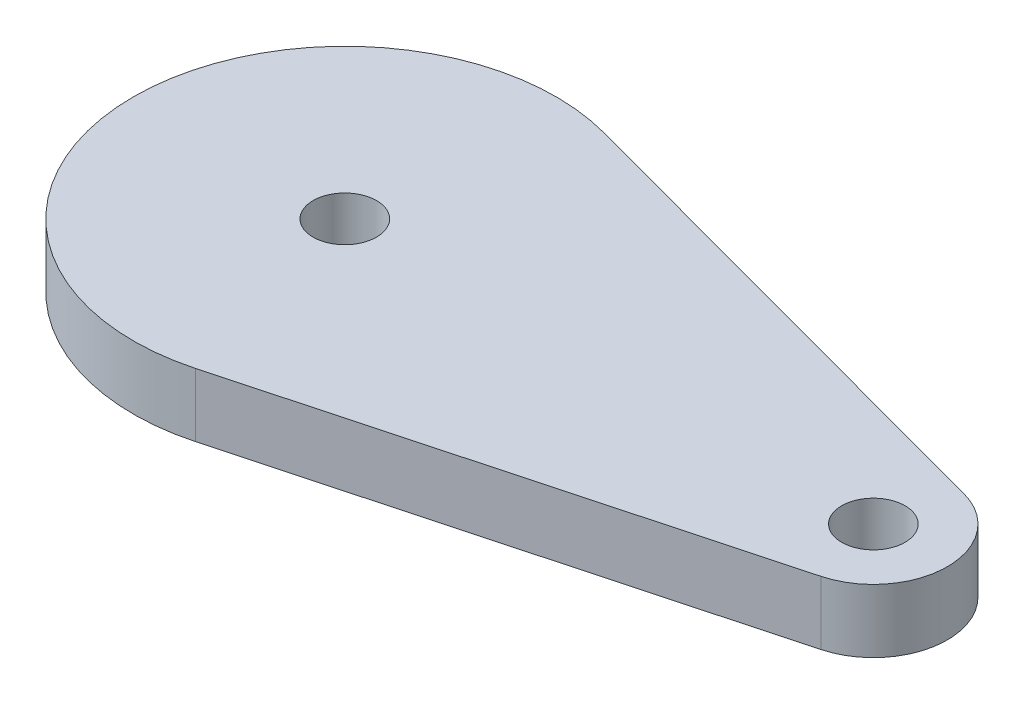
ISO-10303-21;
HEADER;
FILE_DESCRIPTION(('STEP AP214'),'2;1');
FILE_NAME('part.step','',(''),(''),'','','');
FILE_SCHEMA(('AUTOMOTIVE_DESIGN { 1 0 10303 214 1 1 1 1 }'));
ENDSEC;
DATA;
#1=APPLICATION_CONTEXT('core data for automotive mechanical design processes');
#2=APPLICATION_PROTOCOL_DEFINITION('international standard','automotive_design',2000,#1);
#3=PRODUCT_CONTEXT('',#1,'mechanical');
#4=PRODUCT('Part','Part','',(#3));
#5=PRODUCT_RELATED_PRODUCT_CATEGORY('part','',(#4));
#6=PRODUCT_DEFINITION_FORMATION('','',#4);
#7=PRODUCT_DEFINITION_CONTEXT('part definition',#1,'design');
#8=PRODUCT_DEFINITION('design','',#6,#7);
#9=PRODUCT_DEFINITION_SHAPE('','',#8);
#10=(LENGTH_UNIT() NAMED_UNIT(*) SI_UNIT(.MILLI.,.METRE.));
#11=(NAMED_UNIT(*) PLANE_ANGLE_UNIT() SI_UNIT($,.RADIAN.));
#12=(NAMED_UNIT(*) SI_UNIT($,.STERADIAN.) SOLID_ANGLE_UNIT());
#13=UNCERTAINTY_MEASURE_WITH_UNIT(LENGTH_MEASURE(1.E-05),#10,'distance_accuracy_value','');
#14=(GEOMETRIC_REPRESENTATION_CONTEXT(3) GLOBAL_UNCERTAINTY_ASSIGNED_CONTEXT((#13)) GLOBAL_UNIT_ASSIGNED_CONTEXT((#10,
#11,#12)) REPRESENTATION_CONTEXT('',''));
#15=CARTESIAN_POINT('',(0.,0.,0.));
#16=DIRECTION('',(0.,0.,1.));
#17=DIRECTION('',(1.,0.,0.));
#18=AXIS2_PLACEMENT_3D('',#15,#16,#17);
#19=CARTESIAN_POINT('',(-25.,3.,12.5));
#20=DIRECTION('',(0.,1.,0.));
#21=DIRECTION('',(0.,0.,1.));
#22=AXIS2_PLACEMENT_3D('',#19,#20,#21);
#23=PLANE('',#22);
#24=CARTESIAN_POINT('',(0.,3.,12.5));
#25=DIRECTION('',(0.,1.,0.));
#26=DIRECTION('',(0.,0.,1.));
#27=AXIS2_PLACEMENT_3D('',#24,#25,#26);
#28=CIRCLE('',#27,1.5);
#29=CARTESIAN_POINT('',(0.,3.,14.));
#30=VERTEX_POINT('',#29);
#31=EDGE_CURVE('E100',#30,#30,#28,.T.);
#32=ORIENTED_EDGE('',*,*,#31,.F.);
#33=EDGE_LOOP('',(#32));
#34=FACE_BOUND('',#33,.T.);
#35=CARTESIAN_POINT('',(-25.,3.,12.5));
#36=DIRECTION('',(0.,1.,0.));
#37=DIRECTION('',(0.,0.,1.));
#38=AXIS2_PLACEMENT_3D('',#35,#36,#37);
#39=CIRCLE('',#38,10.);
#40=CARTESIAN_POINT('',(-22.4,3.,2.84391383634135));
#41=VERTEX_POINT('',#40);
#42=CARTESIAN_POINT('',(-22.4,3.,22.1560861636587));
#43=VERTEX_POINT('',#42);
#44=EDGE_CURVE('E85',#41,#43,#39,.T.);
#45=ORIENTED_EDGE('',*,*,#44,.T.);
#46=DIRECTION('',(0.965608616365865,0.,-0.260000000000001));
#47=VECTOR('',#46,1.);
#48=CARTESIAN_POINT('',(0.91,3.,15.8796301572805));
#49=LINE('',#48,#47);
#50=CARTESIAN_POINT('',(0.910000000000001,3.,15.8796301572805));
#51=VERTEX_POINT('',#50);
#52=EDGE_CURVE('E80',#43,#51,#49,.T.);
#53=ORIENTED_EDGE('',*,*,#52,.T.);
#54=CARTESIAN_POINT('',(0.,3.,12.5));
#55=DIRECTION('',(0.,1.,0.));
#56=DIRECTION('',(0.,0.,1.));
#57=AXIS2_PLACEMENT_3D('',#54,#55,#56);
#58=CIRCLE('',#57,3.5);
#59=CARTESIAN_POINT('',(0.909999999999999,3.,9.12036984271947));
#60=VERTEX_POINT('',#59);
#61=EDGE_CURVE('E83',#51,#60,#58,.T.);
#62=ORIENTED_EDGE('',*,*,#61,.T.);
#63=DIRECTION('',(-0.965608616365865,0.,-0.26));
#64=VECTOR('',#63,1.);
#65=CARTESIAN_POINT('',(-22.4,3.,2.84391383634135));
#66=LINE('',#65,#64);
#67=EDGE_CURVE('E50',#60,#41,#66,.T.);
#68=ORIENTED_EDGE('',*,*,#67,.T.);
#69=EDGE_LOOP('',(#45,#53,#62,#68));
#70=FACE_BOUND('',#69,.T.);
#71=CARTESIAN_POINT('',(-25.,3.,12.5));
#72=DIRECTION('',(0.,1.,0.));
#73=DIRECTION('',(0.,0.,1.));
#74=AXIS2_PLACEMENT_3D('',#71,#72,#73);
#75=CIRCLE('',#74,1.5);
#76=CARTESIAN_POINT('',(-25.,3.,14.));
#77=VERTEX_POINT('',#76);
#78=EDGE_CURVE('E115',#77,#77,#75,.T.);
#79=ORIENTED_EDGE('',*,*,#78,.F.);
#80=EDGE_LOOP('',(#79));
#81=FACE_BOUND('',#80,.T.);
#82=ADVANCED_FACE('F33',(#34,#70,#81),#23,.T.);
#83=CARTESIAN_POINT('',(-25.,0.,12.5));
#84=DIRECTION('',(0.,1.,0.));
#85=DIRECTION('',(0.,0.,1.));
#86=AXIS2_PLACEMENT_3D('',#83,#84,#85);
#87=PLANE('',#86);
#88=CARTESIAN_POINT('',(-25.,0.,12.5));
#89=DIRECTION('',(0.,1.,0.));
#90=DIRECTION('',(0.,0.,1.));
#91=AXIS2_PLACEMENT_3D('',#88,#89,#90);
#92=CIRCLE('',#91,10.);
#93=CARTESIAN_POINT('',(-22.4,0.,2.84391383634135));
#94=VERTEX_POINT('',#93);
#95=CARTESIAN_POINT('',(-22.4,0.,22.1560861636587));
#96=VERTEX_POINT('',#95);
#97=EDGE_CURVE('E97',#94,#96,#92,.T.);
#98=ORIENTED_EDGE('',*,*,#97,.F.);
#99=DIRECTION('',(-0.965608616365865,0.,-0.26));
#100=VECTOR('',#99,1.);
#101=CARTESIAN_POINT('',(-22.4,0.,2.84391383634135));
#102=LINE('',#101,#100);
#103=CARTESIAN_POINT('',(0.909999999999999,0.,9.12036984271947));
#104=VERTEX_POINT('',#103);
#105=EDGE_CURVE('E73',#104,#94,#102,.T.);
#106=ORIENTED_EDGE('',*,*,#105,.F.);
#107=CARTESIAN_POINT('',(0.,0.,12.5));
#108=DIRECTION('',(0.,1.,0.));
#109=DIRECTION('',(0.,0.,1.));
#110=AXIS2_PLACEMENT_3D('',#107,#108,#109);
#111=CIRCLE('',#110,3.5);
#112=CARTESIAN_POINT('',(0.910000000000001,0.,15.8796301572805));
#113=VERTEX_POINT('',#112);
#114=EDGE_CURVE('E67',#113,#104,#111,.T.);
#115=ORIENTED_EDGE('',*,*,#114,.F.);
#116=DIRECTION('',(0.965608616365865,0.,-0.260000000000001));
#117=VECTOR('',#116,1.);
#118=CARTESIAN_POINT('',(0.91,0.,15.8796301572805));
#119=LINE('',#118,#117);
#120=EDGE_CURVE('E89',#96,#113,#119,.T.);
#121=ORIENTED_EDGE('',*,*,#120,.F.);
#122=EDGE_LOOP('',(#98,#106,#115,#121));
#123=FACE_BOUND('',#122,.T.);
#124=CARTESIAN_POINT('',(0.,0.,12.5));
#125=DIRECTION('',(0.,1.,0.));
#126=DIRECTION('',(0.,0.,1.));
#127=AXIS2_PLACEMENT_3D('',#124,#125,#126);
#128=CIRCLE('',#127,1.5);
#129=CARTESIAN_POINT('',(0.,0.,14.));
#130=VERTEX_POINT('',#129);
#131=EDGE_CURVE('E112',#130,#130,#128,.T.);
#132=ORIENTED_EDGE('',*,*,#131,.T.);
#133=EDGE_LOOP('',(#132));
#134=FACE_BOUND('',#133,.T.);
#135=CARTESIAN_POINT('',(-25.,0.,12.5));
#136=DIRECTION('',(0.,1.,0.));
#137=DIRECTION('',(0.,0.,1.));
#138=AXIS2_PLACEMENT_3D('',#135,#136,#137);
#139=CIRCLE('',#138,1.5);
#140=CARTESIAN_POINT('',(-25.,0.,14.));
#141=VERTEX_POINT('',#140);
#142=EDGE_CURVE('E118',#141,#141,#139,.T.);
#143=ORIENTED_EDGE('',*,*,#142,.T.);
#144=EDGE_LOOP('',(#143));
#145=FACE_BOUND('',#144,.T.);
#146=ADVANCED_FACE('F108',(#123,#134,#145),#87,.F.);
#147=CARTESIAN_POINT('',(-25.,3.,12.5));
#148=DIRECTION('',(0.,-1.,0.));
#149=DIRECTION('',(0.,0.,-1.));
#150=AXIS2_PLACEMENT_3D('',#147,#148,#149);
#151=CYLINDRICAL_SURFACE('',#150,10.);
#152=ORIENTED_EDGE('',*,*,#97,.T.);
#153=DIRECTION('',(0.,-1.,0.));
#154=VECTOR('',#153,1.);
#155=CARTESIAN_POINT('',(-22.4,3.,22.1560861636587));
#156=LINE('',#155,#154);
#157=EDGE_CURVE('E11',#43,#96,#156,.T.);
#158=ORIENTED_EDGE('',*,*,#157,.F.);
#159=ORIENTED_EDGE('',*,*,#44,.F.);
#160=DIRECTION('',(0.,-1.,0.));
#161=VECTOR('',#160,1.);
#162=CARTESIAN_POINT('',(-22.4,3.,2.84391383634135));
#163=LINE('',#162,#161);
#164=EDGE_CURVE('E93',#41,#94,#163,.T.);
#165=ORIENTED_EDGE('',*,*,#164,.T.);
#166=EDGE_LOOP('',(#152,#158,#159,#165));
#167=FACE_BOUND('',#166,.T.);
#168=ADVANCED_FACE('F35',(#167),#151,.T.);
#169=CARTESIAN_POINT('',(0.91,3.,15.8796301572805));
#170=DIRECTION('',(-0.260000000000001,0.,-0.965608616365865));
#171=DIRECTION('',(-0.965608616365865,0.,0.260000000000001));
#172=AXIS2_PLACEMENT_3D('',#169,#170,#171);
#173=PLANE('',#172);
#174=ORIENTED_EDGE('',*,*,#120,.T.);
#175=DIRECTION('',(0.,-1.,0.));
#176=VECTOR('',#175,1.);
#177=CARTESIAN_POINT('',(0.910000000000001,3.,15.8796301572805));
#178=LINE('',#177,#176);
#179=EDGE_CURVE('E42',#51,#113,#178,.T.);
#180=ORIENTED_EDGE('',*,*,#179,.F.);
#181=ORIENTED_EDGE('',*,*,#52,.F.);
#182=ORIENTED_EDGE('',*,*,#157,.T.);
#183=EDGE_LOOP('',(#174,#180,#181,#182));
#184=FACE_BOUND('',#183,.T.);
#185=ADVANCED_FACE('F88',(#184),#173,.F.);
#186=CARTESIAN_POINT('',(0.,3.,12.5));
#187=DIRECTION('',(0.,-1.,0.));
#188=DIRECTION('',(0.,0.,-1.));
#189=AXIS2_PLACEMENT_3D('',#186,#187,#188);
#190=CYLINDRICAL_SURFACE('',#189,3.5);
#191=ORIENTED_EDGE('',*,*,#114,.T.);
#192=DIRECTION('',(0.,-1.,0.));
#193=VECTOR('',#192,1.);
#194=CARTESIAN_POINT('',(0.909999999999999,3.,9.12036984271947));
#195=LINE('',#194,#193);
#196=EDGE_CURVE('E90',#60,#104,#195,.T.);
#197=ORIENTED_EDGE('',*,*,#196,.F.);
#198=ORIENTED_EDGE('',*,*,#61,.F.);
#199=ORIENTED_EDGE('',*,*,#179,.T.);
#200=EDGE_LOOP('',(#191,#197,#198,#199));
#201=FACE_BOUND('',#200,.T.);
#202=ADVANCED_FACE('F91',(#201),#190,.T.);
#203=CARTESIAN_POINT('',(-22.4,3.,2.84391383634135));
#204=DIRECTION('',(-0.26,0.,0.965608616365865));
#205=DIRECTION('',(0.965608616365865,0.,0.26));
#206=AXIS2_PLACEMENT_3D('',#203,#204,#205);
#207=PLANE('',#206);
#208=ORIENTED_EDGE('',*,*,#105,.T.);
#209=ORIENTED_EDGE('',*,*,#164,.F.);
#210=ORIENTED_EDGE('',*,*,#67,.F.);
#211=ORIENTED_EDGE('',*,*,#196,.T.);
#212=EDGE_LOOP('',(#208,#209,#210,#211));
#213=FACE_BOUND('',#212,.T.);
#214=ADVANCED_FACE('F105',(#213),#207,.F.);
#215=CARTESIAN_POINT('',(0.,3.,12.5));
#216=DIRECTION('',(0.,-1.,0.));
#217=DIRECTION('',(0.,0.,-1.));
#218=AXIS2_PLACEMENT_3D('',#215,#216,#217);
#219=CYLINDRICAL_SURFACE('',#218,1.5);
#220=ORIENTED_EDGE('',*,*,#31,.T.);
#221=EDGE_LOOP('',(#220));
#222=FACE_BOUND('',#221,.T.);
#223=ORIENTED_EDGE('',*,*,#131,.F.);
#224=EDGE_LOOP('',(#223));
#225=FACE_BOUND('',#224,.T.);
#226=ADVANCED_FACE('F135',(#222,#225),#219,.F.);
#227=CARTESIAN_POINT('',(-25.,3.,12.5));
#228=DIRECTION('',(0.,-1.,0.));
#229=DIRECTION('',(0.,0.,-1.));
#230=AXIS2_PLACEMENT_3D('',#227,#228,#229);
#231=CYLINDRICAL_SURFACE('',#230,1.5);
#232=ORIENTED_EDGE('',*,*,#78,.T.);
#233=EDGE_LOOP('',(#232));
#234=FACE_BOUND('',#233,.T.);
#235=ORIENTED_EDGE('',*,*,#142,.F.);
#236=EDGE_LOOP('',(#235));
#237=FACE_BOUND('',#236,.T.);
#238=ADVANCED_FACE('F124',(#234,#237),#231,.F.);
#239=CLOSED_SHELL('',(#82,#146,#168,#185,#202,#214,#226,#238));
#240=MANIFOLD_SOLID_BREP('B2',#239);
#241=ADVANCED_BREP_SHAPE_REPRESENTATION('',(#18,#240),#14);
#242=SHAPE_DEFINITION_REPRESENTATION(#9,#241);
ENDSEC;
END-ISO-10303-21;
